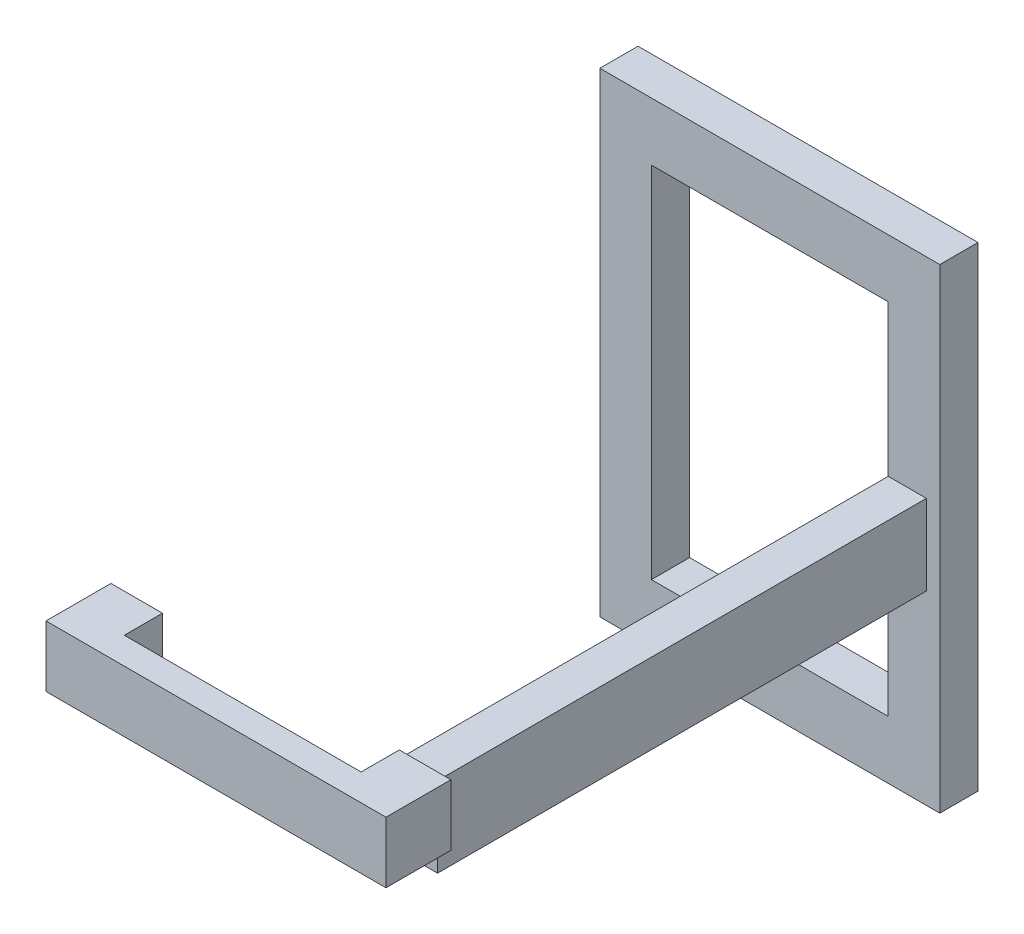
ISO-10303-21;
HEADER;
FILE_DESCRIPTION(('STEP AP214'),'2;1');
FILE_NAME('part.step','',(''),(''),'','','');
FILE_SCHEMA(('AUTOMOTIVE_DESIGN { 1 0 10303 214 1 1 1 1 }'));
ENDSEC;
DATA;
#1=APPLICATION_CONTEXT('core data for automotive mechanical design processes');
#2=APPLICATION_PROTOCOL_DEFINITION('international standard','automotive_design',2000,#1);
#3=PRODUCT_CONTEXT('',#1,'mechanical');
#4=PRODUCT('Part','Part','',(#3));
#5=PRODUCT_RELATED_PRODUCT_CATEGORY('part','',(#4));
#6=PRODUCT_DEFINITION_FORMATION('','',#4);
#7=PRODUCT_DEFINITION_CONTEXT('part definition',#1,'design');
#8=PRODUCT_DEFINITION('design','',#6,#7);
#9=PRODUCT_DEFINITION_SHAPE('','',#8);
#10=(LENGTH_UNIT() NAMED_UNIT(*) SI_UNIT(.MILLI.,.METRE.));
#11=(NAMED_UNIT(*) PLANE_ANGLE_UNIT() SI_UNIT($,.RADIAN.));
#12=(NAMED_UNIT(*) SI_UNIT($,.STERADIAN.) SOLID_ANGLE_UNIT());
#13=UNCERTAINTY_MEASURE_WITH_UNIT(LENGTH_MEASURE(1.E-05),#10,'distance_accuracy_value','');
#14=(GEOMETRIC_REPRESENTATION_CONTEXT(3) GLOBAL_UNCERTAINTY_ASSIGNED_CONTEXT((#13)) GLOBAL_UNIT_ASSIGNED_CONTEXT((#10,
#11,#12)) REPRESENTATION_CONTEXT('',''));
#15=CARTESIAN_POINT('',(0.,0.,0.));
#16=DIRECTION('',(0.,0.,1.));
#17=DIRECTION('',(1.,0.,0.));
#18=AXIS2_PLACEMENT_3D('',#15,#16,#17);
#19=CARTESIAN_POINT('',(0.,0.,138.));
#20=DIRECTION('',(0.,0.,-1.));
#21=DIRECTION('',(-1.,0.,0.));
#22=AXIS2_PLACEMENT_3D('',#19,#20,#21);
#23=PLANE('',#22);
#24=DIRECTION('',(1.,0.,0.));
#25=VECTOR('',#24,1.);
#26=CARTESIAN_POINT('',(-44.5024531865102,9.3935253177337,138.));
#27=LINE('',#26,#25);
#28=CARTESIAN_POINT('',(30.9997229662288,9.3935253177337,138.));
#29=VERTEX_POINT('',#28);
#30=CARTESIAN_POINT('',(44.5024531865102,9.3935253177337,138.));
#31=VERTEX_POINT('',#30);
#32=EDGE_CURVE('E197',#29,#31,#27,.T.);
#33=ORIENTED_EDGE('',*,*,#32,.T.);
#34=DIRECTION('',(0.,1.,0.));
#35=VECTOR('',#34,1.);
#36=CARTESIAN_POINT('',(44.5024531865102,-62.1999298531807,138.));
#37=LINE('',#36,#35);
#38=CARTESIAN_POINT('',(44.5024531865102,-6.61630913683763,138.));
#39=VERTEX_POINT('',#38);
#40=EDGE_CURVE('E214',#39,#31,#37,.T.);
#41=ORIENTED_EDGE('',*,*,#40,.F.);
#42=DIRECTION('',(-1.,0.,0.));
#43=VECTOR('',#42,1.);
#44=CARTESIAN_POINT('',(44.5024531865102,-6.61630913683762,138.));
#45=LINE('',#44,#43);
#46=CARTESIAN_POINT('',(40.9962578426023,-6.61630913683762,138.));
#47=VERTEX_POINT('',#46);
#48=EDGE_CURVE('E68',#39,#47,#45,.T.);
#49=ORIENTED_EDGE('',*,*,#48,.T.);
#50=DIRECTION('',(0.,1.,0.));
#51=VECTOR('',#50,1.);
#52=CARTESIAN_POINT('',(40.9962578426023,7.43313742533675,138.));
#53=LINE('',#52,#51);
#54=CARTESIAN_POINT('',(40.9962578426023,7.43313742533675,138.));
#55=VERTEX_POINT('',#54);
#56=EDGE_CURVE('E228',#47,#55,#53,.T.);
#57=ORIENTED_EDGE('',*,*,#56,.T.);
#58=DIRECTION('',(-1.,0.,0.));
#59=VECTOR('',#58,1.);
#60=CARTESIAN_POINT('',(30.9997229662288,7.43313742533675,138.));
#61=LINE('',#60,#59);
#62=CARTESIAN_POINT('',(30.9997229662288,7.43313742533675,138.));
#63=VERTEX_POINT('',#62);
#64=EDGE_CURVE('E233',#55,#63,#61,.T.);
#65=ORIENTED_EDGE('',*,*,#64,.T.);
#66=DIRECTION('',(0.,1.,0.));
#67=VECTOR('',#66,1.);
#68=CARTESIAN_POINT('',(30.9997229662288,-46.9979836858901,138.));
#69=LINE('',#68,#67);
#70=EDGE_CURVE('E439',#63,#29,#69,.T.);
#71=ORIENTED_EDGE('',*,*,#70,.T.);
#72=EDGE_LOOP('',(#33,#41,#49,#57,#65,#71));
#73=FACE_BOUND('',#72,.T.);
#74=ADVANCED_FACE('F44',(#73),#23,.T.);
#75=CARTESIAN_POINT('',(0.,0.,10.));
#76=DIRECTION('',(0.,0.,1.));
#77=DIRECTION('',(1.,0.,0.));
#78=AXIS2_PLACEMENT_3D('',#75,#76,#77);
#79=PLANE('',#78);
#80=DIRECTION('',(-1.,0.,0.));
#81=VECTOR('',#80,1.);
#82=CARTESIAN_POINT('',(30.9997229662288,7.43313742533675,10.));
#83=LINE('',#82,#81);
#84=CARTESIAN_POINT('',(40.9962578426023,7.43313742533675,10.));
#85=VERTEX_POINT('',#84);
#86=CARTESIAN_POINT('',(30.9997229662288,7.43313742533675,10.));
#87=VERTEX_POINT('',#86);
#88=EDGE_CURVE('E229',#85,#87,#83,.T.);
#89=ORIENTED_EDGE('',*,*,#88,.F.);
#90=DIRECTION('',(0.,1.,0.));
#91=VECTOR('',#90,1.);
#92=CARTESIAN_POINT('',(40.9962578426023,7.43313742533675,10.));
#93=LINE('',#92,#91);
#94=CARTESIAN_POINT('',(40.9962578426023,-13.565923165966,10.));
#95=VERTEX_POINT('',#94);
#96=EDGE_CURVE('E242',#95,#85,#93,.T.);
#97=ORIENTED_EDGE('',*,*,#96,.F.);
#98=DIRECTION('',(1.,0.,0.));
#99=VECTOR('',#98,1.);
#100=CARTESIAN_POINT('',(30.9997229662288,-13.565923165966,10.));
#101=LINE('',#100,#99);
#102=CARTESIAN_POINT('',(30.9997229662288,-13.565923165966,10.));
#103=VERTEX_POINT('',#102);
#104=EDGE_CURVE('E238',#103,#95,#101,.T.);
#105=ORIENTED_EDGE('',*,*,#104,.F.);
#106=DIRECTION('',(0.,1.,0.));
#107=VECTOR('',#106,1.);
#108=CARTESIAN_POINT('',(30.9997229662288,-46.9979836858901,10.));
#109=LINE('',#108,#107);
#110=CARTESIAN_POINT('',(30.9997229662288,-46.9979836858901,10.));
#111=VERTEX_POINT('',#110);
#112=EDGE_CURVE('E265',#111,#103,#109,.T.);
#113=ORIENTED_EDGE('',*,*,#112,.F.);
#114=DIRECTION('',(1.,0.,0.));
#115=VECTOR('',#114,1.);
#116=CARTESIAN_POINT('',(-30.9997229662288,-46.9979836858901,10.));
#117=LINE('',#116,#115);
#118=CARTESIAN_POINT('',(-30.9997229662288,-46.9979836858901,10.));
#119=VERTEX_POINT('',#118);
#120=EDGE_CURVE('E277',#119,#111,#117,.T.);
#121=ORIENTED_EDGE('',*,*,#120,.F.);
#122=DIRECTION('',(0.,-1.,0.));
#123=VECTOR('',#122,1.);
#124=CARTESIAN_POINT('',(-30.9997229662288,-46.9979836858901,10.));
#125=LINE('',#124,#123);
#126=CARTESIAN_POINT('',(-30.9997229662288,46.9979836858901,10.));
#127=VERTEX_POINT('',#126);
#128=EDGE_CURVE('E273',#127,#119,#125,.T.);
#129=ORIENTED_EDGE('',*,*,#128,.F.);
#130=DIRECTION('',(-1.,0.,0.));
#131=VECTOR('',#130,1.);
#132=CARTESIAN_POINT('',(-30.9997229662288,46.9979836858901,10.));
#133=LINE('',#132,#131);
#134=CARTESIAN_POINT('',(30.9997229662288,46.9979836858901,10.));
#135=VERTEX_POINT('',#134);
#136=EDGE_CURVE('E269',#135,#127,#133,.T.);
#137=ORIENTED_EDGE('',*,*,#136,.F.);
#138=EDGE_CURVE('E270',#87,#135,#109,.T.);
#139=ORIENTED_EDGE('',*,*,#138,.F.);
#140=EDGE_LOOP('',(#89,#97,#105,#113,#121,#129,#137,#139));
#141=FACE_BOUND('',#140,.T.);
#142=DIRECTION('',(0.,1.,0.));
#143=VECTOR('',#142,1.);
#144=CARTESIAN_POINT('',(44.5024531865102,62.1999298531807,10.));
#145=LINE('',#144,#143);
#146=CARTESIAN_POINT('',(44.5024531865102,-62.1999298531807,10.));
#147=VERTEX_POINT('',#146);
#148=CARTESIAN_POINT('',(44.5024531865102,62.1999298531807,10.));
#149=VERTEX_POINT('',#148);
#150=EDGE_CURVE('E310',#147,#149,#145,.T.);
#151=ORIENTED_EDGE('',*,*,#150,.T.);
#152=DIRECTION('',(-1.,0.,0.));
#153=VECTOR('',#152,1.);
#154=CARTESIAN_POINT('',(-44.5024531865102,62.1999298531807,10.));
#155=LINE('',#154,#153);
#156=CARTESIAN_POINT('',(-44.5024531865102,62.1999298531807,10.));
#157=VERTEX_POINT('',#156);
#158=EDGE_CURVE('E314',#149,#157,#155,.T.);
#159=ORIENTED_EDGE('',*,*,#158,.T.);
#160=DIRECTION('',(0.,-1.,0.));
#161=VECTOR('',#160,1.);
#162=CARTESIAN_POINT('',(-44.5024531865102,62.1999298531807,10.));
#163=LINE('',#162,#161);
#164=CARTESIAN_POINT('',(-44.5024531865102,-62.1999298531807,10.));
#165=VERTEX_POINT('',#164);
#166=EDGE_CURVE('E318',#157,#165,#163,.T.);
#167=ORIENTED_EDGE('',*,*,#166,.T.);
#168=DIRECTION('',(1.,0.,0.));
#169=VECTOR('',#168,1.);
#170=CARTESIAN_POINT('',(-44.5024531865102,-62.1999298531807,10.));
#171=LINE('',#170,#169);
#172=EDGE_CURVE('E321',#165,#147,#171,.T.);
#173=ORIENTED_EDGE('',*,*,#172,.T.);
#174=EDGE_LOOP('',(#151,#159,#167,#173));
#175=FACE_BOUND('',#174,.T.);
#176=ADVANCED_FACE('F364',(#141,#175),#79,.T.);
#177=CARTESIAN_POINT('',(0.,0.,0.));
#178=DIRECTION('',(0.,0.,1.));
#179=DIRECTION('',(1.,0.,0.));
#180=AXIS2_PLACEMENT_3D('',#177,#178,#179);
#181=PLANE('',#180);
#182=DIRECTION('',(0.,1.,0.));
#183=VECTOR('',#182,1.);
#184=CARTESIAN_POINT('',(44.5024531865102,62.1999298531807,0.));
#185=LINE('',#184,#183);
#186=CARTESIAN_POINT('',(44.5024531865102,-62.1999298531807,0.));
#187=VERTEX_POINT('',#186);
#188=CARTESIAN_POINT('',(44.5024531865102,62.1999298531807,0.));
#189=VERTEX_POINT('',#188);
#190=EDGE_CURVE('E309',#187,#189,#185,.T.);
#191=ORIENTED_EDGE('',*,*,#190,.F.);
#192=DIRECTION('',(1.,0.,0.));
#193=VECTOR('',#192,1.);
#194=CARTESIAN_POINT('',(-44.5024531865102,-62.1999298531807,0.));
#195=LINE('',#194,#193);
#196=CARTESIAN_POINT('',(-44.5024531865102,-62.1999298531807,0.));
#197=VERTEX_POINT('',#196);
#198=EDGE_CURVE('E315',#197,#187,#195,.T.);
#199=ORIENTED_EDGE('',*,*,#198,.F.);
#200=DIRECTION('',(0.,-1.,0.));
#201=VECTOR('',#200,1.);
#202=CARTESIAN_POINT('',(-44.5024531865102,62.1999298531807,0.));
#203=LINE('',#202,#201);
#204=CARTESIAN_POINT('',(-44.5024531865102,62.1999298531807,0.));
#205=VERTEX_POINT('',#204);
#206=EDGE_CURVE('E331',#205,#197,#203,.T.);
#207=ORIENTED_EDGE('',*,*,#206,.F.);
#208=DIRECTION('',(-1.,0.,0.));
#209=VECTOR('',#208,1.);
#210=CARTESIAN_POINT('',(-44.5024531865102,62.1999298531807,0.));
#211=LINE('',#210,#209);
#212=EDGE_CURVE('E328',#189,#205,#211,.T.);
#213=ORIENTED_EDGE('',*,*,#212,.F.);
#214=EDGE_LOOP('',(#191,#199,#207,#213));
#215=FACE_BOUND('',#214,.T.);
#216=DIRECTION('',(0.,1.,0.));
#217=VECTOR('',#216,1.);
#218=CARTESIAN_POINT('',(30.9997229662288,-46.9979836858901,0.));
#219=LINE('',#218,#217);
#220=CARTESIAN_POINT('',(30.9997229662288,-46.9979836858901,0.));
#221=VERTEX_POINT('',#220);
#222=CARTESIAN_POINT('',(30.9997229662288,46.9979836858901,0.));
#223=VERTEX_POINT('',#222);
#224=EDGE_CURVE('E264',#221,#223,#219,.T.);
#225=ORIENTED_EDGE('',*,*,#224,.T.);
#226=DIRECTION('',(-1.,0.,0.));
#227=VECTOR('',#226,1.);
#228=CARTESIAN_POINT('',(-30.9997229662288,46.9979836858901,0.));
#229=LINE('',#228,#227);
#230=CARTESIAN_POINT('',(-30.9997229662288,46.9979836858901,0.));
#231=VERTEX_POINT('',#230);
#232=EDGE_CURVE('E284',#223,#231,#229,.T.);
#233=ORIENTED_EDGE('',*,*,#232,.T.);
#234=DIRECTION('',(0.,-1.,0.));
#235=VECTOR('',#234,1.);
#236=CARTESIAN_POINT('',(-30.9997229662288,-46.9979836858901,0.));
#237=LINE('',#236,#235);
#238=CARTESIAN_POINT('',(-30.9997229662288,-46.9979836858901,0.));
#239=VERTEX_POINT('',#238);
#240=EDGE_CURVE('E288',#231,#239,#237,.T.);
#241=ORIENTED_EDGE('',*,*,#240,.T.);
#242=DIRECTION('',(1.,0.,0.));
#243=VECTOR('',#242,1.);
#244=CARTESIAN_POINT('',(-30.9997229662288,-46.9979836858901,0.));
#245=LINE('',#244,#243);
#246=EDGE_CURVE('E292',#239,#221,#245,.T.);
#247=ORIENTED_EDGE('',*,*,#246,.T.);
#248=EDGE_LOOP('',(#225,#233,#241,#247));
#249=FACE_BOUND('',#248,.T.);
#250=ADVANCED_FACE('F354',(#215,#249),#181,.F.);
#251=CARTESIAN_POINT('',(44.5024531865102,62.1999298531807,10.));
#252=DIRECTION('',(-1.,0.,0.));
#253=DIRECTION('',(0.,0.,1.));
#254=AXIS2_PLACEMENT_3D('',#251,#252,#253);
#255=PLANE('',#254);
#256=ORIENTED_EDGE('',*,*,#190,.T.);
#257=DIRECTION('',(0.,0.,-1.));
#258=VECTOR('',#257,1.);
#259=CARTESIAN_POINT('',(44.5024531865102,62.1999298531807,10.));
#260=LINE('',#259,#258);
#261=EDGE_CURVE('E11',#149,#189,#260,.T.);
#262=ORIENTED_EDGE('',*,*,#261,.F.);
#263=ORIENTED_EDGE('',*,*,#150,.F.);
#264=DIRECTION('',(0.,0.,-1.));
#265=VECTOR('',#264,1.);
#266=CARTESIAN_POINT('',(44.5024531865102,-62.1999298531807,10.));
#267=LINE('',#266,#265);
#268=EDGE_CURVE('E324',#147,#187,#267,.T.);
#269=ORIENTED_EDGE('',*,*,#268,.T.);
#270=EDGE_LOOP('',(#256,#262,#263,#269));
#271=FACE_BOUND('',#270,.T.);
#272=ADVANCED_FACE('F46',(#271),#255,.F.);
#273=CARTESIAN_POINT('',(-44.5024531865102,62.1999298531807,10.));
#274=DIRECTION('',(0.,-1.,0.));
#275=DIRECTION('',(0.,0.,-1.));
#276=AXIS2_PLACEMENT_3D('',#273,#274,#275);
#277=PLANE('',#276);
#278=ORIENTED_EDGE('',*,*,#212,.T.);
#279=DIRECTION('',(0.,0.,-1.));
#280=VECTOR('',#279,1.);
#281=CARTESIAN_POINT('',(-44.5024531865102,62.1999298531807,10.));
#282=LINE('',#281,#280);
#283=EDGE_CURVE('E53',#157,#205,#282,.T.);
#284=ORIENTED_EDGE('',*,*,#283,.F.);
#285=ORIENTED_EDGE('',*,*,#158,.F.);
#286=ORIENTED_EDGE('',*,*,#261,.T.);
#287=EDGE_LOOP('',(#278,#284,#285,#286));
#288=FACE_BOUND('',#287,.T.);
#289=ADVANCED_FACE('F365',(#288),#277,.F.);
#290=CARTESIAN_POINT('',(-44.5024531865102,62.1999298531807,10.));
#291=DIRECTION('',(1.,0.,0.));
#292=DIRECTION('',(0.,0.,-1.));
#293=AXIS2_PLACEMENT_3D('',#290,#291,#292);
#294=PLANE('',#293);
#295=ORIENTED_EDGE('',*,*,#206,.T.);
#296=DIRECTION('',(0.,0.,-1.));
#297=VECTOR('',#296,1.);
#298=CARTESIAN_POINT('',(-44.5024531865102,-62.1999298531807,10.));
#299=LINE('',#298,#297);
#300=EDGE_CURVE('E339',#165,#197,#299,.T.);
#301=ORIENTED_EDGE('',*,*,#300,.F.);
#302=ORIENTED_EDGE('',*,*,#166,.F.);
#303=ORIENTED_EDGE('',*,*,#283,.T.);
#304=EDGE_LOOP('',(#295,#301,#302,#303));
#305=FACE_BOUND('',#304,.T.);
#306=ADVANCED_FACE('F348',(#305),#294,.F.);
#307=CARTESIAN_POINT('',(-44.5024531865102,-62.1999298531807,10.));
#308=DIRECTION('',(0.,1.,0.));
#309=DIRECTION('',(0.,0.,1.));
#310=AXIS2_PLACEMENT_3D('',#307,#308,#309);
#311=PLANE('',#310);
#312=ORIENTED_EDGE('',*,*,#198,.T.);
#313=ORIENTED_EDGE('',*,*,#268,.F.);
#314=ORIENTED_EDGE('',*,*,#172,.F.);
#315=ORIENTED_EDGE('',*,*,#300,.T.);
#316=EDGE_LOOP('',(#312,#313,#314,#315));
#317=FACE_BOUND('',#316,.T.);
#318=ADVANCED_FACE('F358',(#317),#311,.F.);
#319=CARTESIAN_POINT('',(30.9997229662288,-46.9979836858901,10.));
#320=DIRECTION('',(-1.,0.,0.));
#321=DIRECTION('',(0.,0.,1.));
#322=AXIS2_PLACEMENT_3D('',#319,#320,#321);
#323=PLANE('',#322);
#324=DIRECTION('',(0.,0.,1.));
#325=VECTOR('',#324,1.);
#326=CARTESIAN_POINT('',(30.9997229662288,9.39352531773369,10.));
#327=LINE('',#326,#325);
#328=CARTESIAN_POINT('',(30.9997229662288,9.3935253177337,148.));
#329=VERTEX_POINT('',#328);
#330=EDGE_CURVE('E465',#29,#329,#327,.T.);
#331=ORIENTED_EDGE('',*,*,#330,.F.);
#332=ORIENTED_EDGE('',*,*,#70,.F.);
#333=DIRECTION('',(0.,0.,-1.));
#334=VECTOR('',#333,1.);
#335=CARTESIAN_POINT('',(30.9997229662288,7.43313742533675,138.));
#336=LINE('',#335,#334);
#337=EDGE_CURVE('E237',#63,#87,#336,.T.);
#338=ORIENTED_EDGE('',*,*,#337,.T.);
#339=ORIENTED_EDGE('',*,*,#138,.T.);
#340=DIRECTION('',(0.,0.,-1.));
#341=VECTOR('',#340,1.);
#342=CARTESIAN_POINT('',(30.9997229662288,46.9979836858901,10.));
#343=LINE('',#342,#341);
#344=EDGE_CURVE('E305',#135,#223,#343,.T.);
#345=ORIENTED_EDGE('',*,*,#344,.T.);
#346=ORIENTED_EDGE('',*,*,#224,.F.);
#347=DIRECTION('',(0.,0.,-1.));
#348=VECTOR('',#347,1.);
#349=CARTESIAN_POINT('',(30.9997229662288,-46.9979836858901,10.));
#350=LINE('',#349,#348);
#351=EDGE_CURVE('E280',#111,#221,#350,.T.);
#352=ORIENTED_EDGE('',*,*,#351,.F.);
#353=ORIENTED_EDGE('',*,*,#112,.T.);
#354=DIRECTION('',(0.,0.,-1.));
#355=VECTOR('',#354,1.);
#356=CARTESIAN_POINT('',(30.9997229662288,-13.565923165966,138.));
#357=LINE('',#356,#355);
#358=CARTESIAN_POINT('',(30.9997229662288,-13.565923165966,138.));
#359=VERTEX_POINT('',#358);
#360=EDGE_CURVE('E260',#359,#103,#357,.T.);
#361=ORIENTED_EDGE('',*,*,#360,.F.);
#362=DIRECTION('',(0.,1.,0.));
#363=VECTOR('',#362,1.);
#364=CARTESIAN_POINT('',(30.9997229662288,-46.9979836858901,138.));
#365=LINE('',#364,#363);
#366=CARTESIAN_POINT('',(30.9997229662288,-6.61630913683762,138.));
#367=VERTEX_POINT('',#366);
#368=EDGE_CURVE('E426',#359,#367,#365,.T.);
#369=ORIENTED_EDGE('',*,*,#368,.T.);
#370=DIRECTION('',(0.,0.,-1.));
#371=VECTOR('',#370,1.);
#372=CARTESIAN_POINT('',(30.9997229662288,-6.61630913683762,10.));
#373=LINE('',#372,#371);
#374=CARTESIAN_POINT('',(30.9997229662288,-6.61630913683762,148.));
#375=VERTEX_POINT('',#374);
#376=EDGE_CURVE('E471',#375,#367,#373,.T.);
#377=ORIENTED_EDGE('',*,*,#376,.F.);
#378=DIRECTION('',(0.,1.,0.));
#379=VECTOR('',#378,1.);
#380=CARTESIAN_POINT('',(30.9997229662288,9.39352531773371,148.));
#381=LINE('',#380,#379);
#382=EDGE_CURVE('E452',#375,#329,#381,.T.);
#383=ORIENTED_EDGE('',*,*,#382,.T.);
#384=EDGE_LOOP('',(#331,#332,#338,#339,#345,#346,#352,#353,#361,#369,#377,#383));
#385=FACE_BOUND('',#384,.T.);
#386=ADVANCED_FACE('F494',(#385),#323,.T.);
#387=CARTESIAN_POINT('',(-30.9997229662288,46.9979836858901,10.));
#388=DIRECTION('',(0.,-1.,0.));
#389=DIRECTION('',(0.,0.,-1.));
#390=AXIS2_PLACEMENT_3D('',#387,#388,#389);
#391=PLANE('',#390);
#392=ORIENTED_EDGE('',*,*,#232,.F.);
#393=ORIENTED_EDGE('',*,*,#344,.F.);
#394=ORIENTED_EDGE('',*,*,#136,.T.);
#395=DIRECTION('',(0.,0.,-1.));
#396=VECTOR('',#395,1.);
#397=CARTESIAN_POINT('',(-30.9997229662288,46.9979836858901,10.));
#398=LINE('',#397,#396);
#399=EDGE_CURVE('E302',#127,#231,#398,.T.);
#400=ORIENTED_EDGE('',*,*,#399,.T.);
#401=EDGE_LOOP('',(#392,#393,#394,#400));
#402=FACE_BOUND('',#401,.T.);
#403=ADVANCED_FACE('F508',(#402),#391,.T.);
#404=CARTESIAN_POINT('',(-30.9997229662288,-46.9979836858901,10.));
#405=DIRECTION('',(1.,0.,0.));
#406=DIRECTION('',(0.,0.,-1.));
#407=AXIS2_PLACEMENT_3D('',#404,#405,#406);
#408=PLANE('',#407);
#409=ORIENTED_EDGE('',*,*,#240,.F.);
#410=ORIENTED_EDGE('',*,*,#399,.F.);
#411=ORIENTED_EDGE('',*,*,#128,.T.);
#412=DIRECTION('',(0.,0.,-1.));
#413=VECTOR('',#412,1.);
#414=CARTESIAN_POINT('',(-30.9997229662288,-46.9979836858901,10.));
#415=LINE('',#414,#413);
#416=EDGE_CURVE('E299',#119,#239,#415,.T.);
#417=ORIENTED_EDGE('',*,*,#416,.T.);
#418=EDGE_LOOP('',(#409,#410,#411,#417));
#419=FACE_BOUND('',#418,.T.);
#420=ADVANCED_FACE('F512',(#419),#408,.T.);
#421=CARTESIAN_POINT('',(-30.9997229662288,-46.9979836858901,10.));
#422=DIRECTION('',(0.,1.,0.));
#423=DIRECTION('',(0.,0.,1.));
#424=AXIS2_PLACEMENT_3D('',#421,#422,#423);
#425=PLANE('',#424);
#426=ORIENTED_EDGE('',*,*,#246,.F.);
#427=ORIENTED_EDGE('',*,*,#416,.F.);
#428=ORIENTED_EDGE('',*,*,#120,.T.);
#429=ORIENTED_EDGE('',*,*,#351,.T.);
#430=EDGE_LOOP('',(#426,#427,#428,#429));
#431=FACE_BOUND('',#430,.T.);
#432=ADVANCED_FACE('F515',(#431),#425,.T.);
#433=CARTESIAN_POINT('',(30.9997229662288,-13.565923165966,138.));
#434=DIRECTION('',(0.,1.,0.));
#435=DIRECTION('',(0.,0.,1.));
#436=AXIS2_PLACEMENT_3D('',#433,#434,#435);
#437=PLANE('',#436);
#438=ORIENTED_EDGE('',*,*,#104,.T.);
#439=DIRECTION('',(0.,0.,-1.));
#440=VECTOR('',#439,1.);
#441=CARTESIAN_POINT('',(40.9962578426023,-13.565923165966,138.));
#442=LINE('',#441,#440);
#443=CARTESIAN_POINT('',(40.9962578426023,-13.565923165966,138.));
#444=VERTEX_POINT('',#443);
#445=EDGE_CURVE('E256',#444,#95,#442,.T.);
#446=ORIENTED_EDGE('',*,*,#445,.F.);
#447=DIRECTION('',(1.,0.,0.));
#448=VECTOR('',#447,1.);
#449=CARTESIAN_POINT('',(30.9997229662288,-13.565923165966,138.));
#450=LINE('',#449,#448);
#451=EDGE_CURVE('E225',#359,#444,#450,.T.);
#452=ORIENTED_EDGE('',*,*,#451,.F.);
#453=ORIENTED_EDGE('',*,*,#360,.T.);
#454=EDGE_LOOP('',(#438,#446,#452,#453));
#455=FACE_BOUND('',#454,.T.);
#456=ADVANCED_FACE('F429',(#455),#437,.F.);
#457=CARTESIAN_POINT('',(40.9962578426023,7.43313742533675,138.));
#458=DIRECTION('',(-1.,0.,0.));
#459=DIRECTION('',(0.,0.,1.));
#460=AXIS2_PLACEMENT_3D('',#457,#458,#459);
#461=PLANE('',#460);
#462=ORIENTED_EDGE('',*,*,#96,.T.);
#463=DIRECTION('',(0.,0.,-1.));
#464=VECTOR('',#463,1.);
#465=CARTESIAN_POINT('',(40.9962578426023,7.43313742533675,138.));
#466=LINE('',#465,#464);
#467=EDGE_CURVE('E252',#55,#85,#466,.T.);
#468=ORIENTED_EDGE('',*,*,#467,.F.);
#469=ORIENTED_EDGE('',*,*,#56,.F.);
#470=EDGE_CURVE('E230',#444,#47,#53,.T.);
#471=ORIENTED_EDGE('',*,*,#470,.F.);
#472=ORIENTED_EDGE('',*,*,#445,.T.);
#473=EDGE_LOOP('',(#462,#468,#469,#471,#472));
#474=FACE_BOUND('',#473,.T.);
#475=ADVANCED_FACE('F399',(#474),#461,.F.);
#476=CARTESIAN_POINT('',(30.9997229662288,7.43313742533675,138.));
#477=DIRECTION('',(0.,-1.,0.));
#478=DIRECTION('',(0.,0.,-1.));
#479=AXIS2_PLACEMENT_3D('',#476,#477,#478);
#480=PLANE('',#479);
#481=ORIENTED_EDGE('',*,*,#88,.T.);
#482=ORIENTED_EDGE('',*,*,#337,.F.);
#483=ORIENTED_EDGE('',*,*,#64,.F.);
#484=ORIENTED_EDGE('',*,*,#467,.T.);
#485=EDGE_LOOP('',(#481,#482,#483,#484));
#486=FACE_BOUND('',#485,.T.);
#487=ADVANCED_FACE('F394',(#486),#480,.F.);
#488=CARTESIAN_POINT('',(0.,0.,155.));
#489=DIRECTION('',(0.,0.,-1.));
#490=DIRECTION('',(-1.,0.,0.));
#491=AXIS2_PLACEMENT_3D('',#488,#489,#490);
#492=PLANE('',#491);
#493=DIRECTION('',(0.,1.,0.));
#494=VECTOR('',#493,1.);
#495=CARTESIAN_POINT('',(44.5024531865102,-62.1999298531807,155.));
#496=LINE('',#495,#494);
#497=CARTESIAN_POINT('',(44.5024531865102,-6.61630913683762,155.));
#498=VERTEX_POINT('',#497);
#499=CARTESIAN_POINT('',(44.5024531865102,9.39352531773367,155.));
#500=VERTEX_POINT('',#499);
#501=EDGE_CURVE('E213',#498,#500,#496,.T.);
#502=ORIENTED_EDGE('',*,*,#501,.T.);
#503=DIRECTION('',(-1.,0.,0.));
#504=VECTOR('',#503,1.);
#505=CARTESIAN_POINT('',(-30.9997229662288,9.39352531773371,155.));
#506=LINE('',#505,#504);
#507=CARTESIAN_POINT('',(-44.5024531865102,9.3935253177337,155.));
#508=VERTEX_POINT('',#507);
#509=EDGE_CURVE('E60',#500,#508,#506,.T.);
#510=ORIENTED_EDGE('',*,*,#509,.T.);
#511=DIRECTION('',(0.,-1.,0.));
#512=VECTOR('',#511,1.);
#513=CARTESIAN_POINT('',(-44.5024531865102,-62.1999298531807,155.));
#514=LINE('',#513,#512);
#515=CARTESIAN_POINT('',(-44.5024531865102,-6.61630913683762,155.));
#516=VERTEX_POINT('',#515);
#517=EDGE_CURVE('E205',#508,#516,#514,.T.);
#518=ORIENTED_EDGE('',*,*,#517,.T.);
#519=DIRECTION('',(1.,0.,0.));
#520=VECTOR('',#519,1.);
#521=CARTESIAN_POINT('',(-30.9997229662288,-6.61630913683763,155.));
#522=LINE('',#521,#520);
#523=EDGE_CURVE('E447',#516,#498,#522,.T.);
#524=ORIENTED_EDGE('',*,*,#523,.T.);
#525=EDGE_LOOP('',(#502,#510,#518,#524));
#526=FACE_BOUND('',#525,.T.);
#527=ADVANCED_FACE('F387',(#526),#492,.F.);
#528=CARTESIAN_POINT('',(-44.5024531865102,9.3935253177337,138.));
#529=VERTEX_POINT('',#528);
#530=CARTESIAN_POINT('',(-30.9997229662288,9.3935253177337,138.));
#531=VERTEX_POINT('',#530);
#532=EDGE_CURVE('E185',#529,#531,#27,.T.);
#533=ORIENTED_EDGE('',*,*,#532,.T.);
#534=DIRECTION('',(0.,-1.,0.));
#535=VECTOR('',#534,1.);
#536=CARTESIAN_POINT('',(-30.9997229662288,-46.9979836858901,138.));
#537=LINE('',#536,#535);
#538=CARTESIAN_POINT('',(-30.9997229662288,-6.61630913683762,138.));
#539=VERTEX_POINT('',#538);
#540=EDGE_CURVE('E221',#531,#539,#537,.T.);
#541=ORIENTED_EDGE('',*,*,#540,.T.);
#542=CARTESIAN_POINT('',(-44.5024531865102,-6.61630913683762,138.));
#543=VERTEX_POINT('',#542);
#544=EDGE_CURVE('E211',#539,#543,#45,.T.);
#545=ORIENTED_EDGE('',*,*,#544,.T.);
#546=DIRECTION('',(0.,-1.,0.));
#547=VECTOR('',#546,1.);
#548=CARTESIAN_POINT('',(-44.5024531865102,-62.1999298531807,138.));
#549=LINE('',#548,#547);
#550=EDGE_CURVE('E203',#529,#543,#549,.T.);
#551=ORIENTED_EDGE('',*,*,#550,.F.);
#552=EDGE_LOOP('',(#533,#541,#545,#551));
#553=FACE_BOUND('',#552,.T.);
#554=ADVANCED_FACE('F210',(#553),#23,.T.);
#555=CARTESIAN_POINT('',(44.5024531865102,-62.1999298531807,155.));
#556=DIRECTION('',(-1.,0.,0.));
#557=DIRECTION('',(0.,0.,1.));
#558=AXIS2_PLACEMENT_3D('',#555,#556,#557);
#559=PLANE('',#558);
#560=ORIENTED_EDGE('',*,*,#40,.T.);
#561=DIRECTION('',(0.,0.,1.));
#562=VECTOR('',#561,1.);
#563=CARTESIAN_POINT('',(44.5024531865102,9.3935253177337,138.));
#564=LINE('',#563,#562);
#565=EDGE_CURVE('E207',#31,#500,#564,.T.);
#566=ORIENTED_EDGE('',*,*,#565,.T.);
#567=ORIENTED_EDGE('',*,*,#501,.F.);
#568=DIRECTION('',(0.,0.,1.));
#569=VECTOR('',#568,1.);
#570=CARTESIAN_POINT('',(44.5024531865102,-6.61630913683762,138.));
#571=LINE('',#570,#569);
#572=EDGE_CURVE('E482',#39,#498,#571,.T.);
#573=ORIENTED_EDGE('',*,*,#572,.F.);
#574=EDGE_LOOP('',(#560,#566,#567,#573));
#575=FACE_BOUND('',#574,.T.);
#576=ADVANCED_FACE('F386',(#575),#559,.F.);
#577=CARTESIAN_POINT('',(-44.5024531865102,-62.1999298531807,155.));
#578=DIRECTION('',(1.,0.,0.));
#579=DIRECTION('',(0.,0.,-1.));
#580=AXIS2_PLACEMENT_3D('',#577,#578,#579);
#581=PLANE('',#580);
#582=ORIENTED_EDGE('',*,*,#517,.F.);
#583=DIRECTION('',(0.,0.,1.));
#584=VECTOR('',#583,1.);
#585=CARTESIAN_POINT('',(-44.5024531865102,9.3935253177337,138.));
#586=LINE('',#585,#584);
#587=EDGE_CURVE('E188',#529,#508,#586,.T.);
#588=ORIENTED_EDGE('',*,*,#587,.F.);
#589=ORIENTED_EDGE('',*,*,#550,.T.);
#590=DIRECTION('',(0.,0.,1.));
#591=VECTOR('',#590,1.);
#592=CARTESIAN_POINT('',(-44.5024531865102,-6.61630913683762,138.));
#593=LINE('',#592,#591);
#594=EDGE_CURVE('E479',#543,#516,#593,.T.);
#595=ORIENTED_EDGE('',*,*,#594,.T.);
#596=EDGE_LOOP('',(#582,#588,#589,#595));
#597=FACE_BOUND('',#596,.T.);
#598=ADVANCED_FACE('F201',(#597),#581,.F.);
#599=CARTESIAN_POINT('',(-30.9997229662288,-46.9979836858901,155.));
#600=DIRECTION('',(1.,0.,0.));
#601=DIRECTION('',(0.,0.,-1.));
#602=AXIS2_PLACEMENT_3D('',#599,#600,#601);
#603=PLANE('',#602);
#604=DIRECTION('',(0.,0.,-1.));
#605=VECTOR('',#604,1.);
#606=CARTESIAN_POINT('',(-30.9997229662288,9.39352531773369,155.));
#607=LINE('',#606,#605);
#608=CARTESIAN_POINT('',(-30.9997229662288,9.39352531773371,148.));
#609=VERTEX_POINT('',#608);
#610=EDGE_CURVE('E191',#609,#531,#607,.T.);
#611=ORIENTED_EDGE('',*,*,#610,.F.);
#612=DIRECTION('',(0.,-1.,0.));
#613=VECTOR('',#612,1.);
#614=CARTESIAN_POINT('',(-30.9997229662288,9.39352531773371,148.));
#615=LINE('',#614,#613);
#616=CARTESIAN_POINT('',(-30.9997229662288,-6.61630913683763,148.));
#617=VERTEX_POINT('',#616);
#618=EDGE_CURVE('E446',#609,#617,#615,.T.);
#619=ORIENTED_EDGE('',*,*,#618,.T.);
#620=DIRECTION('',(0.,0.,1.));
#621=VECTOR('',#620,1.);
#622=CARTESIAN_POINT('',(-30.9997229662288,-6.61630913683762,155.));
#623=LINE('',#622,#621);
#624=EDGE_CURVE('E470',#539,#617,#623,.T.);
#625=ORIENTED_EDGE('',*,*,#624,.F.);
#626=ORIENTED_EDGE('',*,*,#540,.F.);
#627=EDGE_LOOP('',(#611,#619,#625,#626));
#628=FACE_BOUND('',#627,.T.);
#629=ADVANCED_FACE('F403',(#628),#603,.T.);
#630=CARTESIAN_POINT('',(-30.9997229662288,9.39352531773371,148.));
#631=DIRECTION('',(0.,1.,0.));
#632=DIRECTION('',(0.,0.,1.));
#633=AXIS2_PLACEMENT_3D('',#630,#631,#632);
#634=PLANE('',#633);
#635=ORIENTED_EDGE('',*,*,#509,.F.);
#636=ORIENTED_EDGE('',*,*,#565,.F.);
#637=ORIENTED_EDGE('',*,*,#32,.F.);
#638=ORIENTED_EDGE('',*,*,#330,.T.);
#639=DIRECTION('',(-1.,0.,0.));
#640=VECTOR('',#639,1.);
#641=CARTESIAN_POINT('',(-30.9997229662288,9.39352531773371,148.));
#642=LINE('',#641,#640);
#643=EDGE_CURVE('E443',#329,#609,#642,.T.);
#644=ORIENTED_EDGE('',*,*,#643,.T.);
#645=ORIENTED_EDGE('',*,*,#610,.T.);
#646=ORIENTED_EDGE('',*,*,#532,.F.);
#647=ORIENTED_EDGE('',*,*,#587,.T.);
#648=EDGE_LOOP('',(#635,#636,#637,#638,#644,#645,#646,#647));
#649=FACE_BOUND('',#648,.T.);
#650=ADVANCED_FACE('F187',(#649),#634,.T.);
#651=CARTESIAN_POINT('',(-30.9997229662288,-6.61630913683763,148.));
#652=DIRECTION('',(0.,-1.,0.));
#653=DIRECTION('',(0.,0.,-1.));
#654=AXIS2_PLACEMENT_3D('',#651,#652,#653);
#655=PLANE('',#654);
#656=ORIENTED_EDGE('',*,*,#523,.F.);
#657=ORIENTED_EDGE('',*,*,#594,.F.);
#658=ORIENTED_EDGE('',*,*,#544,.F.);
#659=ORIENTED_EDGE('',*,*,#624,.T.);
#660=DIRECTION('',(1.,0.,0.));
#661=VECTOR('',#660,1.);
#662=CARTESIAN_POINT('',(-30.9997229662288,-6.61630913683763,148.));
#663=LINE('',#662,#661);
#664=EDGE_CURVE('E456',#617,#375,#663,.T.);
#665=ORIENTED_EDGE('',*,*,#664,.T.);
#666=ORIENTED_EDGE('',*,*,#376,.T.);
#667=EDGE_CURVE('E478',#47,#367,#45,.T.);
#668=ORIENTED_EDGE('',*,*,#667,.F.);
#669=ORIENTED_EDGE('',*,*,#48,.F.);
#670=ORIENTED_EDGE('',*,*,#572,.T.);
#671=EDGE_LOOP('',(#656,#657,#658,#659,#665,#666,#668,#669,#670));
#672=FACE_BOUND('',#671,.T.);
#673=ADVANCED_FACE('F407',(#672),#655,.T.);
#674=CARTESIAN_POINT('',(0.,0.,148.));
#675=DIRECTION('',(0.,0.,1.));
#676=DIRECTION('',(1.,0.,0.));
#677=AXIS2_PLACEMENT_3D('',#674,#675,#676);
#678=PLANE('',#677);
#679=ORIENTED_EDGE('',*,*,#618,.F.);
#680=ORIENTED_EDGE('',*,*,#643,.F.);
#681=ORIENTED_EDGE('',*,*,#382,.F.);
#682=ORIENTED_EDGE('',*,*,#664,.F.);
#683=EDGE_LOOP('',(#679,#680,#681,#682));
#684=FACE_BOUND('',#683,.T.);
#685=ADVANCED_FACE('F410',(#684),#678,.F.);
#686=CARTESIAN_POINT('',(0.,0.,138.));
#687=DIRECTION('',(0.,0.,1.));
#688=DIRECTION('',(1.,0.,0.));
#689=AXIS2_PLACEMENT_3D('',#686,#687,#688);
#690=PLANE('',#689);
#691=ORIENTED_EDGE('',*,*,#451,.T.);
#692=ORIENTED_EDGE('',*,*,#470,.T.);
#693=ORIENTED_EDGE('',*,*,#667,.T.);
#694=ORIENTED_EDGE('',*,*,#368,.F.);
#695=EDGE_LOOP('',(#691,#692,#693,#694));
#696=FACE_BOUND('',#695,.T.);
#697=ADVANCED_FACE('F415',(#696),#690,.T.);
#698=CLOSED_SHELL('',(#74,#176,#250,#272,#289,#306,#318,#386,#403,#420,#432,#456,#475,#487,#527,
#554,#576,#598,#629,#650,#673,#685,#697));
#699=MANIFOLD_SOLID_BREP('B2',#698);
#700=ADVANCED_BREP_SHAPE_REPRESENTATION('',(#18,#699),#14);
#701=SHAPE_DEFINITION_REPRESENTATION(#9,#700);
ENDSEC;
END-ISO-10303-21;
